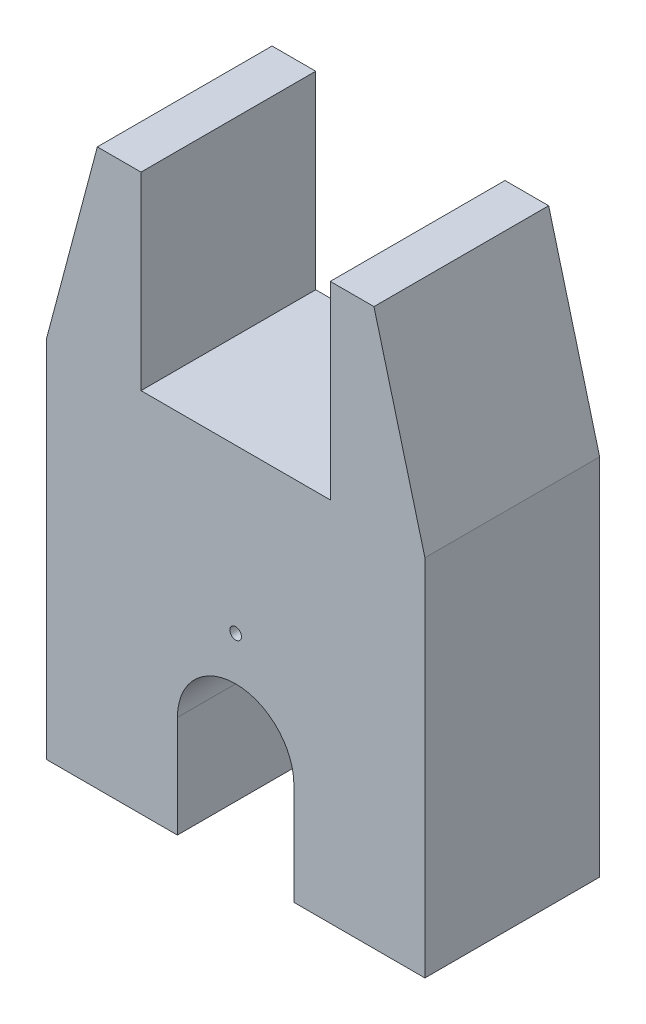
ISO-10303-21;
HEADER;
FILE_DESCRIPTION(('STEP AP214'),'2;1');
FILE_NAME('part.step','',(''),(''),'','','');
FILE_SCHEMA(('AUTOMOTIVE_DESIGN { 1 0 10303 214 1 1 1 1 }'));
ENDSEC;
DATA;
#1=APPLICATION_CONTEXT('core data for automotive mechanical design processes');
#2=APPLICATION_PROTOCOL_DEFINITION('international standard','automotive_design',2000,#1);
#3=PRODUCT_CONTEXT('',#1,'mechanical');
#4=PRODUCT('Part','Part','',(#3));
#5=PRODUCT_RELATED_PRODUCT_CATEGORY('part','',(#4));
#6=PRODUCT_DEFINITION_FORMATION('','',#4);
#7=PRODUCT_DEFINITION_CONTEXT('part definition',#1,'design');
#8=PRODUCT_DEFINITION('design','',#6,#7);
#9=PRODUCT_DEFINITION_SHAPE('','',#8);
#10=(LENGTH_UNIT() NAMED_UNIT(*) SI_UNIT(.MILLI.,.METRE.));
#11=(NAMED_UNIT(*) PLANE_ANGLE_UNIT() SI_UNIT($,.RADIAN.));
#12=(NAMED_UNIT(*) SI_UNIT($,.STERADIAN.) SOLID_ANGLE_UNIT());
#13=UNCERTAINTY_MEASURE_WITH_UNIT(LENGTH_MEASURE(1.E-05),#10,'distance_accuracy_value','');
#14=(GEOMETRIC_REPRESENTATION_CONTEXT(3) GLOBAL_UNCERTAINTY_ASSIGNED_CONTEXT((#13)) GLOBAL_UNIT_ASSIGNED_CONTEXT((#10,
#11,#12)) REPRESENTATION_CONTEXT('',''));
#15=CARTESIAN_POINT('',(0.,0.,0.));
#16=DIRECTION('',(0.,0.,1.));
#17=DIRECTION('',(1.,0.,0.));
#18=AXIS2_PLACEMENT_3D('',#15,#16,#17);
#19=CARTESIAN_POINT('',(1206.49999999999,3960.876,-2.22044604925031E-13));
#20=DIRECTION('',(0.,1.,0.));
#21=DIRECTION('',(-1.,0.,0.));
#22=AXIS2_PLACEMENT_3D('',#19,#20,#21);
#23=PLANE('',#22);
#24=DIRECTION('',(0.,0.,-1.));
#25=VECTOR('',#24,1.);
#26=CARTESIAN_POINT('',(-825.500000000005,3960.876,1524.));
#27=LINE('',#26,#25);
#28=CARTESIAN_POINT('',(-825.500000000005,3960.876,1524.));
#29=VERTEX_POINT('',#28);
#30=CARTESIAN_POINT('',(-825.500000000005,3960.876,0.));
#31=VERTEX_POINT('',#30);
#32=EDGE_CURVE('E165',#29,#31,#27,.T.);
#33=ORIENTED_EDGE('',*,*,#32,.T.);
#34=DIRECTION('',(-1.,0.,0.));
#35=VECTOR('',#34,1.);
#36=CARTESIAN_POINT('',(1206.49999999999,3960.876,-2.22044604925031E-13));
#37=LINE('',#36,#35);
#38=CARTESIAN_POINT('',(-1206.50000000001,3960.876,-2.22044604925031E-13));
#39=VERTEX_POINT('',#38);
#40=EDGE_CURVE('E221',#31,#39,#37,.T.);
#41=ORIENTED_EDGE('',*,*,#40,.T.);
#42=DIRECTION('',(0.,0.,1.));
#43=VECTOR('',#42,1.);
#44=CARTESIAN_POINT('',(-1206.50000000001,3960.876,-2.22044604925031E-13));
#45=LINE('',#44,#43);
#46=CARTESIAN_POINT('',(-1206.50000000001,3960.876,1524.));
#47=VERTEX_POINT('',#46);
#48=EDGE_CURVE('E11',#39,#47,#45,.T.);
#49=ORIENTED_EDGE('',*,*,#48,.T.);
#50=DIRECTION('',(-1.,0.,0.));
#51=VECTOR('',#50,1.);
#52=CARTESIAN_POINT('',(1206.49999999999,3960.876,1524.));
#53=LINE('',#52,#51);
#54=EDGE_CURVE('E240',#29,#47,#53,.T.);
#55=ORIENTED_EDGE('',*,*,#54,.F.);
#56=EDGE_LOOP('',(#33,#41,#49,#55));
#57=FACE_BOUND('',#56,.T.);
#58=ADVANCED_FACE('F36',(#57),#23,.T.);
#59=CARTESIAN_POINT('',(-1651.,-889.000000000003,-2.22044604925031E-13));
#60=DIRECTION('',(0.,-1.,0.));
#61=DIRECTION('',(1.,0.,0.));
#62=AXIS2_PLACEMENT_3D('',#59,#60,#61);
#63=PLANE('',#62);
#64=DIRECTION('',(0.,0.,-1.));
#65=VECTOR('',#64,1.);
#66=CARTESIAN_POINT('',(508.000000000005,-888.999999999999,1524.));
#67=LINE('',#66,#65);
#68=CARTESIAN_POINT('',(508.000000000005,-888.999999999999,1524.));
#69=VERTEX_POINT('',#68);
#70=CARTESIAN_POINT('',(508.000000000005,-888.999999999999,0.));
#71=VERTEX_POINT('',#70);
#72=EDGE_CURVE('E188',#69,#71,#67,.T.);
#73=ORIENTED_EDGE('',*,*,#72,.T.);
#74=DIRECTION('',(1.,0.,0.));
#75=VECTOR('',#74,1.);
#76=CARTESIAN_POINT('',(-1651.,-889.000000000003,-2.22044604925031E-13));
#77=LINE('',#76,#75);
#78=CARTESIAN_POINT('',(1651.,-888.999999999997,-2.22044604925031E-13));
#79=VERTEX_POINT('',#78);
#80=EDGE_CURVE('E211',#71,#79,#77,.T.);
#81=ORIENTED_EDGE('',*,*,#80,.T.);
#82=DIRECTION('',(0.,0.,1.));
#83=VECTOR('',#82,1.);
#84=CARTESIAN_POINT('',(1651.,-888.999999999997,-2.22044604925031E-13));
#85=LINE('',#84,#83);
#86=CARTESIAN_POINT('',(1651.,-888.999999999997,1524.));
#87=VERTEX_POINT('',#86);
#88=EDGE_CURVE('E246',#79,#87,#85,.T.);
#89=ORIENTED_EDGE('',*,*,#88,.T.);
#90=DIRECTION('',(1.,0.,0.));
#91=VECTOR('',#90,1.);
#92=CARTESIAN_POINT('',(-1651.,-889.000000000003,1524.));
#93=LINE('',#92,#91);
#94=EDGE_CURVE('E230',#69,#87,#93,.T.);
#95=ORIENTED_EDGE('',*,*,#94,.F.);
#96=EDGE_LOOP('',(#73,#81,#89,#95));
#97=FACE_BOUND('',#96,.T.);
#98=ADVANCED_FACE('F284',(#97),#63,.T.);
#99=CARTESIAN_POINT('',(-1206.50000000001,3960.876,-2.22044604925031E-13));
#100=DIRECTION('',(-0.966540794113082,0.25651294960538,0.));
#101=DIRECTION('',(-0.25651294960538,-0.966540794113082,0.));
#102=AXIS2_PLACEMENT_3D('',#99,#100,#101);
#103=PLANE('',#102);
#104=DIRECTION('',(-0.25651294960538,-0.966540794113082,0.));
#105=VECTOR('',#104,1.);
#106=CARTESIAN_POINT('',(-1206.50000000001,3960.876,1524.));
#107=LINE('',#106,#105);
#108=CARTESIAN_POINT('',(-1651.,2286.,1524.));
#109=VERTEX_POINT('',#108);
#110=EDGE_CURVE('E197',#47,#109,#107,.T.);
#111=ORIENTED_EDGE('',*,*,#110,.F.);
#112=ORIENTED_EDGE('',*,*,#48,.F.);
#113=DIRECTION('',(-0.25651294960538,-0.966540794113082,0.));
#114=VECTOR('',#113,1.);
#115=CARTESIAN_POINT('',(-1206.50000000001,3960.876,-2.22044604925031E-13));
#116=LINE('',#115,#114);
#117=CARTESIAN_POINT('',(-1651.,2286.,-2.22044604925031E-13));
#118=VERTEX_POINT('',#117);
#119=EDGE_CURVE('E204',#39,#118,#116,.T.);
#120=ORIENTED_EDGE('',*,*,#119,.T.);
#121=DIRECTION('',(0.,0.,1.));
#122=VECTOR('',#121,1.);
#123=CARTESIAN_POINT('',(-1651.,2286.,-2.22044604925031E-13));
#124=LINE('',#123,#122);
#125=EDGE_CURVE('E40',#118,#109,#124,.T.);
#126=ORIENTED_EDGE('',*,*,#125,.T.);
#127=EDGE_LOOP('',(#111,#112,#120,#126));
#128=FACE_BOUND('',#127,.T.);
#129=ADVANCED_FACE('F38',(#128),#103,.T.);
#130=DIRECTION('',(0.,0.,-1.));
#131=VECTOR('',#130,1.);
#132=CARTESIAN_POINT('',(825.499999999995,3960.876,1524.));
#133=LINE('',#132,#131);
#134=CARTESIAN_POINT('',(825.499999999995,3960.876,1524.));
#135=VERTEX_POINT('',#134);
#136=CARTESIAN_POINT('',(825.499999999995,3960.876,0.));
#137=VERTEX_POINT('',#136);
#138=EDGE_CURVE('E176',#135,#137,#133,.T.);
#139=ORIENTED_EDGE('',*,*,#138,.F.);
#140=CARTESIAN_POINT('',(1206.49999999999,3960.876,1524.));
#141=VERTEX_POINT('',#140);
#142=EDGE_CURVE('E208',#141,#135,#53,.T.);
#143=ORIENTED_EDGE('',*,*,#142,.F.);
#144=DIRECTION('',(0.,0.,1.));
#145=VECTOR('',#144,1.);
#146=CARTESIAN_POINT('',(1206.49999999999,3960.876,-2.22044604925031E-13));
#147=LINE('',#146,#145);
#148=CARTESIAN_POINT('',(1206.49999999999,3960.876,-2.22044604925031E-13));
#149=VERTEX_POINT('',#148);
#150=EDGE_CURVE('E45',#149,#141,#147,.T.);
#151=ORIENTED_EDGE('',*,*,#150,.F.);
#152=EDGE_CURVE('E222',#149,#137,#37,.T.);
#153=ORIENTED_EDGE('',*,*,#152,.T.);
#154=EDGE_LOOP('',(#139,#143,#151,#153));
#155=FACE_BOUND('',#154,.T.);
#156=ADVANCED_FACE('F297',(#155),#23,.T.);
#157=CARTESIAN_POINT('',(1651.,2286.,-2.22044604925031E-13));
#158=DIRECTION('',(0.966540794113081,0.256512949605385,0.));
#159=DIRECTION('',(-0.256512949605385,0.966540794113081,0.));
#160=AXIS2_PLACEMENT_3D('',#157,#158,#159);
#161=PLANE('',#160);
#162=DIRECTION('',(-0.256512949605385,0.966540794113081,0.));
#163=VECTOR('',#162,1.);
#164=CARTESIAN_POINT('',(1651.,2286.,1524.));
#165=LINE('',#164,#163);
#166=CARTESIAN_POINT('',(1651.,2286.,1524.));
#167=VERTEX_POINT('',#166);
#168=EDGE_CURVE('E237',#167,#141,#165,.T.);
#169=ORIENTED_EDGE('',*,*,#168,.F.);
#170=DIRECTION('',(0.,0.,1.));
#171=VECTOR('',#170,1.);
#172=CARTESIAN_POINT('',(1651.,2286.,-2.22044604925031E-13));
#173=LINE('',#172,#171);
#174=CARTESIAN_POINT('',(1651.,2286.,-2.22044604925031E-13));
#175=VERTEX_POINT('',#174);
#176=EDGE_CURVE('E244',#175,#167,#173,.T.);
#177=ORIENTED_EDGE('',*,*,#176,.F.);
#178=DIRECTION('',(-0.256512949605385,0.966540794113081,0.));
#179=VECTOR('',#178,1.);
#180=CARTESIAN_POINT('',(1651.,2286.,-2.22044604925031E-13));
#181=LINE('',#180,#179);
#182=EDGE_CURVE('E218',#175,#149,#181,.T.);
#183=ORIENTED_EDGE('',*,*,#182,.T.);
#184=ORIENTED_EDGE('',*,*,#150,.T.);
#185=EDGE_LOOP('',(#169,#177,#183,#184));
#186=FACE_BOUND('',#185,.T.);
#187=ADVANCED_FACE('F293',(#186),#161,.T.);
#188=CARTESIAN_POINT('',(1651.,-888.999999999997,-2.22044604925031E-13));
#189=DIRECTION('',(1.,0.,0.));
#190=DIRECTION('',(0.,1.,0.));
#191=AXIS2_PLACEMENT_3D('',#188,#189,#190);
#192=PLANE('',#191);
#193=DIRECTION('',(0.,1.,0.));
#194=VECTOR('',#193,1.);
#195=CARTESIAN_POINT('',(1651.,-888.999999999997,1524.));
#196=LINE('',#195,#194);
#197=EDGE_CURVE('E234',#87,#167,#196,.T.);
#198=ORIENTED_EDGE('',*,*,#197,.F.);
#199=ORIENTED_EDGE('',*,*,#88,.F.);
#200=DIRECTION('',(0.,1.,0.));
#201=VECTOR('',#200,1.);
#202=CARTESIAN_POINT('',(1651.,-888.999999999997,-2.22044604925031E-13));
#203=LINE('',#202,#201);
#204=EDGE_CURVE('E215',#79,#175,#203,.T.);
#205=ORIENTED_EDGE('',*,*,#204,.T.);
#206=ORIENTED_EDGE('',*,*,#176,.T.);
#207=EDGE_LOOP('',(#198,#199,#205,#206));
#208=FACE_BOUND('',#207,.T.);
#209=ADVANCED_FACE('F290',(#208),#192,.T.);
#210=DIRECTION('',(0.,0.,-1.));
#211=VECTOR('',#210,1.);
#212=CARTESIAN_POINT('',(-507.999999999995,-889.000000000001,1524.));
#213=LINE('',#212,#211);
#214=CARTESIAN_POINT('',(-507.999999999995,-889.000000000001,1524.));
#215=VERTEX_POINT('',#214);
#216=CARTESIAN_POINT('',(-507.999999999995,-889.000000000001,0.));
#217=VERTEX_POINT('',#216);
#218=EDGE_CURVE('E200',#215,#217,#213,.T.);
#219=ORIENTED_EDGE('',*,*,#218,.F.);
#220=CARTESIAN_POINT('',(-1651.,-889.000000000003,1524.));
#221=VERTEX_POINT('',#220);
#222=EDGE_CURVE('E231',#221,#215,#93,.T.);
#223=ORIENTED_EDGE('',*,*,#222,.F.);
#224=DIRECTION('',(0.,0.,1.));
#225=VECTOR('',#224,1.);
#226=CARTESIAN_POINT('',(-1651.,-889.000000000003,-2.22044604925031E-13));
#227=LINE('',#226,#225);
#228=CARTESIAN_POINT('',(-1651.,-889.000000000003,-2.22044604925031E-13));
#229=VERTEX_POINT('',#228);
#230=EDGE_CURVE('E248',#229,#221,#227,.T.);
#231=ORIENTED_EDGE('',*,*,#230,.F.);
#232=EDGE_CURVE('E212',#229,#217,#77,.T.);
#233=ORIENTED_EDGE('',*,*,#232,.T.);
#234=EDGE_LOOP('',(#219,#223,#231,#233));
#235=FACE_BOUND('',#234,.T.);
#236=ADVANCED_FACE('F272',(#235),#63,.T.);
#237=CARTESIAN_POINT('',(-1651.,2286.,-2.22044604925031E-13));
#238=DIRECTION('',(-1.,0.,0.));
#239=DIRECTION('',(0.,-1.,0.));
#240=AXIS2_PLACEMENT_3D('',#237,#238,#239);
#241=PLANE('',#240);
#242=DIRECTION('',(0.,-1.,0.));
#243=VECTOR('',#242,1.);
#244=CARTESIAN_POINT('',(-1651.,2286.,1524.));
#245=LINE('',#244,#243);
#246=EDGE_CURVE('E227',#109,#221,#245,.T.);
#247=ORIENTED_EDGE('',*,*,#246,.F.);
#248=ORIENTED_EDGE('',*,*,#125,.F.);
#249=DIRECTION('',(0.,-1.,0.));
#250=VECTOR('',#249,1.);
#251=CARTESIAN_POINT('',(-1651.,2286.,-2.22044604925031E-13));
#252=LINE('',#251,#250);
#253=EDGE_CURVE('E207',#118,#229,#252,.T.);
#254=ORIENTED_EDGE('',*,*,#253,.T.);
#255=ORIENTED_EDGE('',*,*,#230,.T.);
#256=EDGE_LOOP('',(#247,#248,#254,#255));
#257=FACE_BOUND('',#256,.T.);
#258=ADVANCED_FACE('F257',(#257),#241,.T.);
#259=CARTESIAN_POINT('',(0.,0.,-6.66133814775094E-13));
#260=DIRECTION('',(0.,0.,1.));
#261=DIRECTION('',(1.,0.,0.));
#262=AXIS2_PLACEMENT_3D('',#259,#260,#261);
#263=PLANE('',#262);
#264=ORIENTED_EDGE('',*,*,#40,.F.);
#265=DIRECTION('',(0.,1.,0.));
#266=VECTOR('',#265,1.);
#267=CARTESIAN_POINT('',(-825.500000000002,2309.876,0.));
#268=LINE('',#267,#266);
#269=CARTESIAN_POINT('',(-825.500000000002,2309.876,0.));
#270=VERTEX_POINT('',#269);
#271=EDGE_CURVE('E150',#270,#31,#268,.T.);
#272=ORIENTED_EDGE('',*,*,#271,.F.);
#273=DIRECTION('',(-1.,0.,0.));
#274=VECTOR('',#273,1.);
#275=CARTESIAN_POINT('',(825.499999999998,2309.876,0.));
#276=LINE('',#275,#274);
#277=CARTESIAN_POINT('',(825.499999999998,2309.876,0.));
#278=VERTEX_POINT('',#277);
#279=EDGE_CURVE('E162',#278,#270,#276,.T.);
#280=ORIENTED_EDGE('',*,*,#279,.F.);
#281=DIRECTION('',(0.,-1.,0.));
#282=VECTOR('',#281,1.);
#283=CARTESIAN_POINT('',(825.499999999995,3960.876,0.));
#284=LINE('',#283,#282);
#285=EDGE_CURVE('E153',#137,#278,#284,.T.);
#286=ORIENTED_EDGE('',*,*,#285,.F.);
#287=ORIENTED_EDGE('',*,*,#152,.F.);
#288=ORIENTED_EDGE('',*,*,#182,.F.);
#289=ORIENTED_EDGE('',*,*,#204,.F.);
#290=ORIENTED_EDGE('',*,*,#80,.F.);
#291=DIRECTION('',(0.,-1.,0.));
#292=VECTOR('',#291,1.);
#293=CARTESIAN_POINT('',(508.000000000003,0.,0.));
#294=LINE('',#293,#292);
#295=CARTESIAN_POINT('',(508.,0.,0.));
#296=VERTEX_POINT('',#295);
#297=EDGE_CURVE('E173',#296,#71,#294,.T.);
#298=ORIENTED_EDGE('',*,*,#297,.F.);
#299=CARTESIAN_POINT('',(0.,0.,0.));
#300=DIRECTION('',(0.,0.,-1.));
#301=DIRECTION('',(-1.,0.,0.));
#302=AXIS2_PLACEMENT_3D('',#299,#300,#301);
#303=CIRCLE('',#302,508.);
#304=CARTESIAN_POINT('',(-507.999999999997,-8.88178419700125E-13,0.));
#305=VERTEX_POINT('',#304);
#306=EDGE_CURVE('E184',#305,#296,#303,.T.);
#307=ORIENTED_EDGE('',*,*,#306,.F.);
#308=DIRECTION('',(0.,1.,0.));
#309=VECTOR('',#308,1.);
#310=CARTESIAN_POINT('',(-507.999999999995,-889.000000000001,0.));
#311=LINE('',#310,#309);
#312=EDGE_CURVE('E190',#217,#305,#311,.T.);
#313=ORIENTED_EDGE('',*,*,#312,.F.);
#314=ORIENTED_EDGE('',*,*,#232,.F.);
#315=ORIENTED_EDGE('',*,*,#253,.F.);
#316=ORIENTED_EDGE('',*,*,#119,.F.);
#317=EDGE_LOOP('',(#264,#272,#280,#286,#287,#288,#289,#290,#298,#307,#313,#314,#315,#316));
#318=FACE_BOUND('',#317,.T.);
#319=ADVANCED_FACE('F265',(#318),#263,.F.);
#320=CARTESIAN_POINT('',(0.,0.,1524.));
#321=DIRECTION('',(0.,0.,1.));
#322=DIRECTION('',(1.,0.,0.));
#323=AXIS2_PLACEMENT_3D('',#320,#321,#322);
#324=PLANE('',#323);
#325=CARTESIAN_POINT('',(0.,889.,1524.));
#326=DIRECTION('',(0.,0.,1.));
#327=DIRECTION('',(1.,0.,0.));
#328=AXIS2_PLACEMENT_3D('',#325,#326,#327);
#329=CIRCLE('',#328,50.8);
#330=CARTESIAN_POINT('',(50.8,889.,1524.));
#331=VERTEX_POINT('',#330);
#332=EDGE_CURVE('E151',#331,#331,#329,.T.);
#333=ORIENTED_EDGE('',*,*,#332,.F.);
#334=EDGE_LOOP('',(#333));
#335=FACE_BOUND('',#334,.T.);
#336=DIRECTION('',(0.,1.,0.));
#337=VECTOR('',#336,1.);
#338=CARTESIAN_POINT('',(-825.500000000002,2309.876,1524.));
#339=LINE('',#338,#337);
#340=CARTESIAN_POINT('',(-825.500000000002,2309.876,1524.));
#341=VERTEX_POINT('',#340);
#342=EDGE_CURVE('E158',#341,#29,#339,.T.);
#343=ORIENTED_EDGE('',*,*,#342,.T.);
#344=ORIENTED_EDGE('',*,*,#54,.T.);
#345=ORIENTED_EDGE('',*,*,#110,.T.);
#346=ORIENTED_EDGE('',*,*,#246,.T.);
#347=ORIENTED_EDGE('',*,*,#222,.T.);
#348=DIRECTION('',(0.,1.,0.));
#349=VECTOR('',#348,1.);
#350=CARTESIAN_POINT('',(-507.999999999995,-889.000000000001,1524.));
#351=LINE('',#350,#349);
#352=CARTESIAN_POINT('',(-507.999999999997,-8.8817841970012E-13,1524.));
#353=VERTEX_POINT('',#352);
#354=EDGE_CURVE('E183',#215,#353,#351,.T.);
#355=ORIENTED_EDGE('',*,*,#354,.T.);
#356=CARTESIAN_POINT('',(0.,0.,1524.));
#357=DIRECTION('',(0.,0.,-1.));
#358=DIRECTION('',(-1.,0.,0.));
#359=AXIS2_PLACEMENT_3D('',#356,#357,#358);
#360=CIRCLE('',#359,508.);
#361=CARTESIAN_POINT('',(508.,0.,1524.));
#362=VERTEX_POINT('',#361);
#363=EDGE_CURVE('E61',#353,#362,#360,.T.);
#364=ORIENTED_EDGE('',*,*,#363,.T.);
#365=DIRECTION('',(0.,-1.,0.));
#366=VECTOR('',#365,1.);
#367=CARTESIAN_POINT('',(508.000000000003,0.,1524.));
#368=LINE('',#367,#366);
#369=EDGE_CURVE('E180',#362,#69,#368,.T.);
#370=ORIENTED_EDGE('',*,*,#369,.T.);
#371=ORIENTED_EDGE('',*,*,#94,.T.);
#372=ORIENTED_EDGE('',*,*,#197,.T.);
#373=ORIENTED_EDGE('',*,*,#168,.T.);
#374=ORIENTED_EDGE('',*,*,#142,.T.);
#375=DIRECTION('',(0.,-1.,0.));
#376=VECTOR('',#375,1.);
#377=CARTESIAN_POINT('',(825.499999999995,3960.876,1524.));
#378=LINE('',#377,#376);
#379=CARTESIAN_POINT('',(825.499999999998,2309.876,1524.));
#380=VERTEX_POINT('',#379);
#381=EDGE_CURVE('E161',#135,#380,#378,.T.);
#382=ORIENTED_EDGE('',*,*,#381,.T.);
#383=DIRECTION('',(-1.,0.,0.));
#384=VECTOR('',#383,1.);
#385=CARTESIAN_POINT('',(825.499999999998,2309.876,1524.));
#386=LINE('',#385,#384);
#387=EDGE_CURVE('E53',#380,#341,#386,.T.);
#388=ORIENTED_EDGE('',*,*,#387,.T.);
#389=EDGE_LOOP('',(#343,#344,#345,#346,#347,#355,#364,#370,#371,#372,#373,#374,#382,#388));
#390=FACE_BOUND('',#389,.T.);
#391=ADVANCED_FACE('F259',(#335,#390),#324,.T.);
#392=CARTESIAN_POINT('',(508.000000000003,0.,1524.));
#393=DIRECTION('',(1.,0.,0.));
#394=DIRECTION('',(0.,1.,0.));
#395=AXIS2_PLACEMENT_3D('',#392,#393,#394);
#396=PLANE('',#395);
#397=ORIENTED_EDGE('',*,*,#297,.T.);
#398=ORIENTED_EDGE('',*,*,#72,.F.);
#399=ORIENTED_EDGE('',*,*,#369,.F.);
#400=DIRECTION('',(0.,0.,-1.));
#401=VECTOR('',#400,1.);
#402=CARTESIAN_POINT('',(508.,0.,1524.));
#403=LINE('',#402,#401);
#404=EDGE_CURVE('E195',#362,#296,#403,.T.);
#405=ORIENTED_EDGE('',*,*,#404,.T.);
#406=EDGE_LOOP('',(#397,#398,#399,#405));
#407=FACE_BOUND('',#406,.T.);
#408=ADVANCED_FACE('F281',(#407),#396,.F.);
#409=CARTESIAN_POINT('',(0.,0.,1524.));
#410=DIRECTION('',(0.,0.,-1.));
#411=DIRECTION('',(-1.,0.,0.));
#412=AXIS2_PLACEMENT_3D('',#409,#410,#411);
#413=CYLINDRICAL_SURFACE('',#412,508.);
#414=ORIENTED_EDGE('',*,*,#306,.T.);
#415=ORIENTED_EDGE('',*,*,#404,.F.);
#416=ORIENTED_EDGE('',*,*,#363,.F.);
#417=DIRECTION('',(0.,0.,-1.));
#418=VECTOR('',#417,1.);
#419=CARTESIAN_POINT('',(-507.999999999997,-8.88178419700125E-13,1524.));
#420=LINE('',#419,#418);
#421=EDGE_CURVE('E198',#353,#305,#420,.T.);
#422=ORIENTED_EDGE('',*,*,#421,.T.);
#423=EDGE_LOOP('',(#414,#415,#416,#422));
#424=FACE_BOUND('',#423,.T.);
#425=ADVANCED_FACE('F275',(#424),#413,.F.);
#426=CARTESIAN_POINT('',(-507.999999999995,-889.000000000001,1524.));
#427=DIRECTION('',(-1.,0.,0.));
#428=DIRECTION('',(0.,-1.,0.));
#429=AXIS2_PLACEMENT_3D('',#426,#427,#428);
#430=PLANE('',#429);
#431=ORIENTED_EDGE('',*,*,#312,.T.);
#432=ORIENTED_EDGE('',*,*,#421,.F.);
#433=ORIENTED_EDGE('',*,*,#354,.F.);
#434=ORIENTED_EDGE('',*,*,#218,.T.);
#435=EDGE_LOOP('',(#431,#432,#433,#434));
#436=FACE_BOUND('',#435,.T.);
#437=ADVANCED_FACE('F274',(#436),#430,.F.);
#438=CARTESIAN_POINT('',(-825.500000000002,2309.876,1524.));
#439=DIRECTION('',(-1.,0.,0.));
#440=DIRECTION('',(0.,-1.,0.));
#441=AXIS2_PLACEMENT_3D('',#438,#439,#440);
#442=PLANE('',#441);
#443=ORIENTED_EDGE('',*,*,#271,.T.);
#444=ORIENTED_EDGE('',*,*,#32,.F.);
#445=ORIENTED_EDGE('',*,*,#342,.F.);
#446=DIRECTION('',(0.,0.,-1.));
#447=VECTOR('',#446,1.);
#448=CARTESIAN_POINT('',(-825.500000000002,2309.876,1524.));
#449=LINE('',#448,#447);
#450=EDGE_CURVE('E171',#341,#270,#449,.T.);
#451=ORIENTED_EDGE('',*,*,#450,.T.);
#452=EDGE_LOOP('',(#443,#444,#445,#451));
#453=FACE_BOUND('',#452,.T.);
#454=ADVANCED_FACE('F303',(#453),#442,.F.);
#455=CARTESIAN_POINT('',(825.499999999998,2309.876,1524.));
#456=DIRECTION('',(0.,-1.,0.));
#457=DIRECTION('',(0.,0.,-1.));
#458=AXIS2_PLACEMENT_3D('',#455,#456,#457);
#459=PLANE('',#458);
#460=ORIENTED_EDGE('',*,*,#279,.T.);
#461=ORIENTED_EDGE('',*,*,#450,.F.);
#462=ORIENTED_EDGE('',*,*,#387,.F.);
#463=DIRECTION('',(0.,0.,-1.));
#464=VECTOR('',#463,1.);
#465=CARTESIAN_POINT('',(825.499999999998,2309.876,1524.));
#466=LINE('',#465,#464);
#467=EDGE_CURVE('E174',#380,#278,#466,.T.);
#468=ORIENTED_EDGE('',*,*,#467,.T.);
#469=EDGE_LOOP('',(#460,#461,#462,#468));
#470=FACE_BOUND('',#469,.T.);
#471=ADVANCED_FACE('F301',(#470),#459,.F.);
#472=CARTESIAN_POINT('',(825.499999999995,3960.876,1524.));
#473=DIRECTION('',(1.,0.,0.));
#474=DIRECTION('',(0.,1.,0.));
#475=AXIS2_PLACEMENT_3D('',#472,#473,#474);
#476=PLANE('',#475);
#477=ORIENTED_EDGE('',*,*,#285,.T.);
#478=ORIENTED_EDGE('',*,*,#467,.F.);
#479=ORIENTED_EDGE('',*,*,#381,.F.);
#480=ORIENTED_EDGE('',*,*,#138,.T.);
#481=EDGE_LOOP('',(#477,#478,#479,#480));
#482=FACE_BOUND('',#481,.T.);
#483=ADVANCED_FACE('F144',(#482),#476,.F.);
#484=CARTESIAN_POINT('',(0.,889.,762.));
#485=DIRECTION('',(0.,0.,1.));
#486=DIRECTION('',(1.,0.,0.));
#487=AXIS2_PLACEMENT_3D('',#484,#485,#486);
#488=CONICAL_SURFACE('',#487,50.7999999999999,1.02974425867666);
#489=CARTESIAN_POINT('',(0.,889.,731.4762805534));
#490=VERTEX_POINT('',#489);
#491=VERTEX_LOOP('',#490);
#492=FACE_BOUND('',#491,.T.);
#493=CARTESIAN_POINT('',(0.,889.,762.));
#494=DIRECTION('',(0.,0.,1.));
#495=DIRECTION('',(1.,0.,0.));
#496=AXIS2_PLACEMENT_3D('',#493,#494,#495);
#497=CIRCLE('',#496,50.7999999999999);
#498=CARTESIAN_POINT('',(50.7999999999999,889.,762.));
#499=VERTEX_POINT('',#498);
#500=EDGE_CURVE('E148',#499,#499,#497,.T.);
#501=ORIENTED_EDGE('',*,*,#500,.T.);
#502=EDGE_LOOP('',(#501));
#503=FACE_BOUND('',#502,.T.);
#504=ADVANCED_FACE('F140',(#492,#503),#488,.F.);
#505=CARTESIAN_POINT('',(0.,889.,1524.));
#506=DIRECTION('',(0.,0.,1.));
#507=DIRECTION('',(1.,0.,0.));
#508=AXIS2_PLACEMENT_3D('',#505,#506,#507);
#509=CYLINDRICAL_SURFACE('',#508,50.8);
#510=ORIENTED_EDGE('',*,*,#500,.F.);
#511=EDGE_LOOP('',(#510));
#512=FACE_BOUND('',#511,.T.);
#513=ORIENTED_EDGE('',*,*,#332,.T.);
#514=EDGE_LOOP('',(#513));
#515=FACE_BOUND('',#514,.T.);
#516=ADVANCED_FACE('F143',(#512,#515),#509,.F.);
#517=CLOSED_SHELL('',(#58,#98,#129,#156,#187,#209,#236,#258,#319,#391,#408,#425,#437,#454,#471,
#483,#504,#516));
#518=MANIFOLD_SOLID_BREP('B2',#517);
#519=ADVANCED_BREP_SHAPE_REPRESENTATION('',(#18,#518),#14);
#520=SHAPE_DEFINITION_REPRESENTATION(#9,#519);
ENDSEC;
END-ISO-10303-21;
